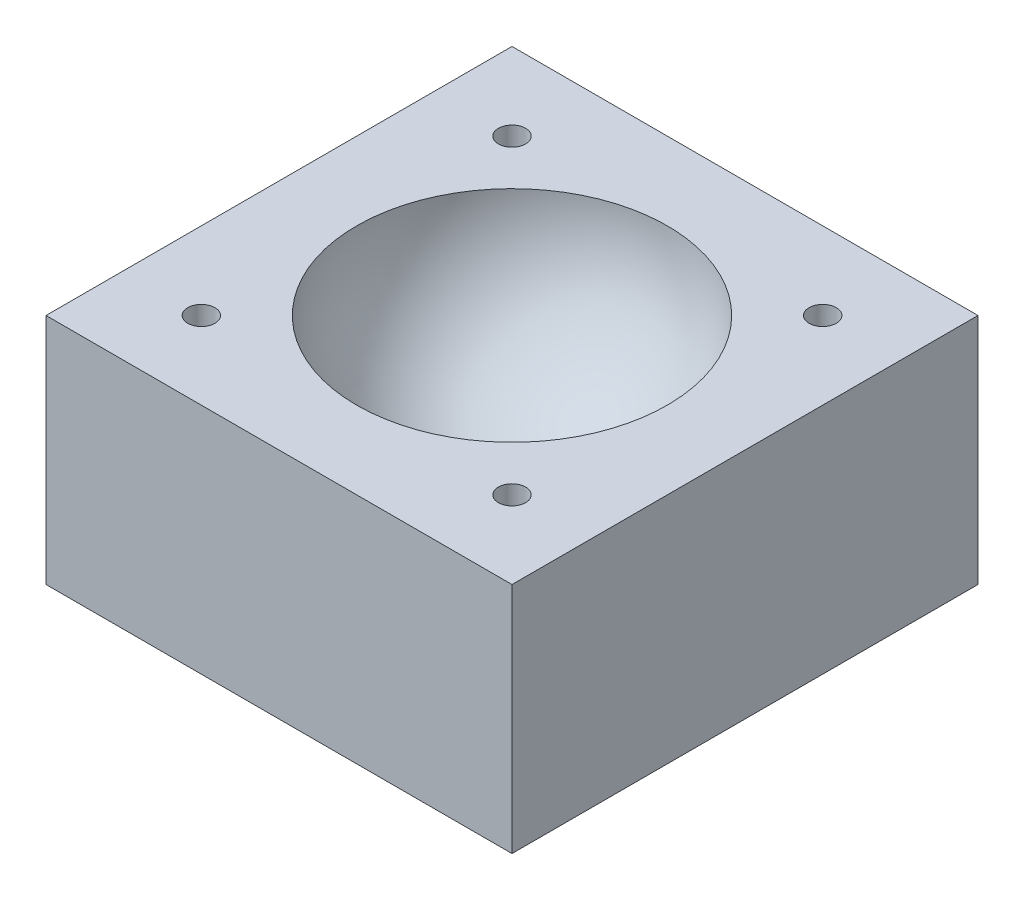
ISO-10303-21;
HEADER;
FILE_DESCRIPTION(('STEP AP214'),'2;1');
FILE_NAME('part.step','',(''),(''),'','','');
FILE_SCHEMA(('AUTOMOTIVE_DESIGN { 1 0 10303 214 1 1 1 1 }'));
ENDSEC;
DATA;
#1=APPLICATION_CONTEXT('core data for automotive mechanical design processes');
#2=APPLICATION_PROTOCOL_DEFINITION('international standard','automotive_design',2000,#1);
#3=PRODUCT_CONTEXT('',#1,'mechanical');
#4=PRODUCT('Part','Part','',(#3));
#5=PRODUCT_RELATED_PRODUCT_CATEGORY('part','',(#4));
#6=PRODUCT_DEFINITION_FORMATION('','',#4);
#7=PRODUCT_DEFINITION_CONTEXT('part definition',#1,'design');
#8=PRODUCT_DEFINITION('design','',#6,#7);
#9=PRODUCT_DEFINITION_SHAPE('','',#8);
#10=(LENGTH_UNIT() NAMED_UNIT(*) SI_UNIT(.MILLI.,.METRE.));
#11=(NAMED_UNIT(*) PLANE_ANGLE_UNIT() SI_UNIT($,.RADIAN.));
#12=(NAMED_UNIT(*) SI_UNIT($,.STERADIAN.) SOLID_ANGLE_UNIT());
#13=UNCERTAINTY_MEASURE_WITH_UNIT(LENGTH_MEASURE(1.E-05),#10,'distance_accuracy_value','');
#14=(GEOMETRIC_REPRESENTATION_CONTEXT(3) GLOBAL_UNCERTAINTY_ASSIGNED_CONTEXT((#13)) GLOBAL_UNIT_ASSIGNED_CONTEXT((#10,
#11,#12)) REPRESENTATION_CONTEXT('',''));
#15=CARTESIAN_POINT('',(0.,0.,0.));
#16=DIRECTION('',(0.,0.,1.));
#17=DIRECTION('',(1.,0.,0.));
#18=AXIS2_PLACEMENT_3D('',#15,#16,#17);
#19=CARTESIAN_POINT('',(30.,30.,-30.));
#20=DIRECTION('',(-1.,0.,0.));
#21=DIRECTION('',(0.,0.,1.));
#22=AXIS2_PLACEMENT_3D('',#19,#20,#21);
#23=PLANE('',#22);
#24=DIRECTION('',(0.,0.,-1.));
#25=VECTOR('',#24,1.);
#26=CARTESIAN_POINT('',(30.,0.,-30.));
#27=LINE('',#26,#25);
#28=CARTESIAN_POINT('',(30.,0.,30.));
#29=VERTEX_POINT('',#28);
#30=CARTESIAN_POINT('',(30.,0.,-30.));
#31=VERTEX_POINT('',#30);
#32=EDGE_CURVE('E107',#29,#31,#27,.T.);
#33=ORIENTED_EDGE('',*,*,#32,.T.);
#34=DIRECTION('',(0.,-1.,0.));
#35=VECTOR('',#34,1.);
#36=CARTESIAN_POINT('',(30.,30.,-30.));
#37=LINE('',#36,#35);
#38=CARTESIAN_POINT('',(30.,30.,-30.));
#39=VERTEX_POINT('',#38);
#40=EDGE_CURVE('E11',#39,#31,#37,.T.);
#41=ORIENTED_EDGE('',*,*,#40,.F.);
#42=DIRECTION('',(0.,0.,-1.));
#43=VECTOR('',#42,1.);
#44=CARTESIAN_POINT('',(30.,30.,-30.));
#45=LINE('',#44,#43);
#46=CARTESIAN_POINT('',(30.,30.,30.));
#47=VERTEX_POINT('',#46);
#48=EDGE_CURVE('E91',#47,#39,#45,.T.);
#49=ORIENTED_EDGE('',*,*,#48,.F.);
#50=DIRECTION('',(0.,-1.,0.));
#51=VECTOR('',#50,1.);
#52=CARTESIAN_POINT('',(30.,30.,30.));
#53=LINE('',#52,#51);
#54=EDGE_CURVE('E103',#47,#29,#53,.T.);
#55=ORIENTED_EDGE('',*,*,#54,.T.);
#56=EDGE_LOOP('',(#33,#41,#49,#55));
#57=FACE_BOUND('',#56,.T.);
#58=ADVANCED_FACE('F39',(#57),#23,.F.);
#59=CARTESIAN_POINT('',(-30.,30.,-30.));
#60=DIRECTION('',(0.,0.,1.));
#61=DIRECTION('',(1.,0.,0.));
#62=AXIS2_PLACEMENT_3D('',#59,#60,#61);
#63=PLANE('',#62);
#64=DIRECTION('',(-1.,0.,0.));
#65=VECTOR('',#64,1.);
#66=CARTESIAN_POINT('',(-30.,0.,-30.));
#67=LINE('',#66,#65);
#68=CARTESIAN_POINT('',(-30.,0.,-30.));
#69=VERTEX_POINT('',#68);
#70=EDGE_CURVE('E96',#31,#69,#67,.T.);
#71=ORIENTED_EDGE('',*,*,#70,.T.);
#72=DIRECTION('',(0.,-1.,0.));
#73=VECTOR('',#72,1.);
#74=CARTESIAN_POINT('',(-30.,30.,-30.));
#75=LINE('',#74,#73);
#76=CARTESIAN_POINT('',(-30.,30.,-30.));
#77=VERTEX_POINT('',#76);
#78=EDGE_CURVE('E48',#77,#69,#75,.T.);
#79=ORIENTED_EDGE('',*,*,#78,.F.);
#80=DIRECTION('',(-1.,0.,0.));
#81=VECTOR('',#80,1.);
#82=CARTESIAN_POINT('',(-30.,30.,-30.));
#83=LINE('',#82,#81);
#84=EDGE_CURVE('E86',#39,#77,#83,.T.);
#85=ORIENTED_EDGE('',*,*,#84,.F.);
#86=ORIENTED_EDGE('',*,*,#40,.T.);
#87=EDGE_LOOP('',(#71,#79,#85,#86));
#88=FACE_BOUND('',#87,.T.);
#89=ADVANCED_FACE('F95',(#88),#63,.F.);
#90=CARTESIAN_POINT('',(-30.,30.,-30.));
#91=DIRECTION('',(1.,0.,0.));
#92=DIRECTION('',(0.,0.,-1.));
#93=AXIS2_PLACEMENT_3D('',#90,#91,#92);
#94=PLANE('',#93);
#95=DIRECTION('',(0.,0.,1.));
#96=VECTOR('',#95,1.);
#97=CARTESIAN_POINT('',(-30.,0.,-30.));
#98=LINE('',#97,#96);
#99=CARTESIAN_POINT('',(-30.,0.,30.));
#100=VERTEX_POINT('',#99);
#101=EDGE_CURVE('E73',#69,#100,#98,.T.);
#102=ORIENTED_EDGE('',*,*,#101,.T.);
#103=DIRECTION('',(0.,-1.,0.));
#104=VECTOR('',#103,1.);
#105=CARTESIAN_POINT('',(-30.,30.,30.));
#106=LINE('',#105,#104);
#107=CARTESIAN_POINT('',(-30.,30.,30.));
#108=VERTEX_POINT('',#107);
#109=EDGE_CURVE('E98',#108,#100,#106,.T.);
#110=ORIENTED_EDGE('',*,*,#109,.F.);
#111=DIRECTION('',(0.,0.,1.));
#112=VECTOR('',#111,1.);
#113=CARTESIAN_POINT('',(-30.,30.,-30.));
#114=LINE('',#113,#112);
#115=EDGE_CURVE('E89',#77,#108,#114,.T.);
#116=ORIENTED_EDGE('',*,*,#115,.F.);
#117=ORIENTED_EDGE('',*,*,#78,.T.);
#118=EDGE_LOOP('',(#102,#110,#116,#117));
#119=FACE_BOUND('',#118,.T.);
#120=ADVANCED_FACE('F99',(#119),#94,.F.);
#121=CARTESIAN_POINT('',(-30.,30.,30.));
#122=DIRECTION('',(0.,0.,-1.));
#123=DIRECTION('',(-1.,0.,0.));
#124=AXIS2_PLACEMENT_3D('',#121,#122,#123);
#125=PLANE('',#124);
#126=DIRECTION('',(1.,0.,0.));
#127=VECTOR('',#126,1.);
#128=CARTESIAN_POINT('',(-30.,0.,30.));
#129=LINE('',#128,#127);
#130=EDGE_CURVE('E79',#100,#29,#129,.T.);
#131=ORIENTED_EDGE('',*,*,#130,.T.);
#132=ORIENTED_EDGE('',*,*,#54,.F.);
#133=DIRECTION('',(1.,0.,0.));
#134=VECTOR('',#133,1.);
#135=CARTESIAN_POINT('',(-30.,30.,30.));
#136=LINE('',#135,#134);
#137=EDGE_CURVE('E56',#108,#47,#136,.T.);
#138=ORIENTED_EDGE('',*,*,#137,.F.);
#139=ORIENTED_EDGE('',*,*,#109,.T.);
#140=EDGE_LOOP('',(#131,#132,#138,#139));
#141=FACE_BOUND('',#140,.T.);
#142=ADVANCED_FACE('F121',(#141),#125,.F.);
#143=CARTESIAN_POINT('',(0.,30.,0.));
#144=DIRECTION('',(0.,1.,0.));
#145=DIRECTION('',(0.,0.,1.));
#146=AXIS2_PLACEMENT_3D('',#143,#144,#145);
#147=PLANE('',#146);
#148=CARTESIAN_POINT('',(-20.,30.,20.));
#149=DIRECTION('',(0.,1.,0.));
#150=DIRECTION('',(0.,0.,1.));
#151=AXIS2_PLACEMENT_3D('',#148,#149,#150);
#152=CIRCLE('',#151,1.75);
#153=CARTESIAN_POINT('',(-20.,30.,21.75));
#154=VERTEX_POINT('',#153);
#155=EDGE_CURVE('E149',#154,#154,#152,.T.);
#156=ORIENTED_EDGE('',*,*,#155,.F.);
#157=EDGE_LOOP('',(#156));
#158=FACE_BOUND('',#157,.T.);
#159=CARTESIAN_POINT('',(20.,30.,-20.));
#160=DIRECTION('',(0.,1.,0.));
#161=DIRECTION('',(0.,0.,1.));
#162=AXIS2_PLACEMENT_3D('',#159,#160,#161);
#163=CIRCLE('',#162,1.75);
#164=CARTESIAN_POINT('',(20.,30.,-18.25));
#165=VERTEX_POINT('',#164);
#166=EDGE_CURVE('E140',#165,#165,#163,.T.);
#167=ORIENTED_EDGE('',*,*,#166,.F.);
#168=EDGE_LOOP('',(#167));
#169=FACE_BOUND('',#168,.T.);
#170=CARTESIAN_POINT('',(20.,30.,20.));
#171=DIRECTION('',(0.,1.,0.));
#172=DIRECTION('',(0.,0.,1.));
#173=AXIS2_PLACEMENT_3D('',#170,#171,#172);
#174=CIRCLE('',#173,1.75);
#175=CARTESIAN_POINT('',(20.,30.,21.75));
#176=VERTEX_POINT('',#175);
#177=EDGE_CURVE('E156',#176,#176,#174,.T.);
#178=ORIENTED_EDGE('',*,*,#177,.F.);
#179=EDGE_LOOP('',(#178));
#180=FACE_BOUND('',#179,.T.);
#181=CARTESIAN_POINT('',(-20.,30.,-20.));
#182=DIRECTION('',(0.,1.,0.));
#183=DIRECTION('',(0.,0.,1.));
#184=AXIS2_PLACEMENT_3D('',#181,#182,#183);
#185=CIRCLE('',#184,1.75);
#186=CARTESIAN_POINT('',(-20.,30.,-18.25));
#187=VERTEX_POINT('',#186);
#188=EDGE_CURVE('E132',#187,#187,#185,.T.);
#189=ORIENTED_EDGE('',*,*,#188,.F.);
#190=EDGE_LOOP('',(#189));
#191=FACE_BOUND('',#190,.T.);
#192=CARTESIAN_POINT('',(0.,30.,0.));
#193=DIRECTION('',(0.,-1.,0.));
#194=DIRECTION('',(0.,0.,1.));
#195=AXIS2_PLACEMENT_3D('',#192,#193,#194);
#196=CIRCLE('',#195,20.);
#197=CARTESIAN_POINT('',(0.,30.,20.));
#198=VERTEX_POINT('',#197);
#199=EDGE_CURVE('E111',#198,#198,#196,.T.);
#200=ORIENTED_EDGE('',*,*,#199,.T.);
#201=EDGE_LOOP('',(#200));
#202=FACE_BOUND('',#201,.T.);
#203=ORIENTED_EDGE('',*,*,#48,.T.);
#204=ORIENTED_EDGE('',*,*,#84,.T.);
#205=ORIENTED_EDGE('',*,*,#115,.T.);
#206=ORIENTED_EDGE('',*,*,#137,.T.);
#207=EDGE_LOOP('',(#203,#204,#205,#206));
#208=FACE_BOUND('',#207,.T.);
#209=ADVANCED_FACE('F87',(#158,#169,#180,#191,#202,#208),#147,.T.);
#210=CARTESIAN_POINT('',(0.,0.,0.));
#211=DIRECTION('',(0.,1.,0.));
#212=DIRECTION('',(0.,0.,1.));
#213=AXIS2_PLACEMENT_3D('',#210,#211,#212);
#214=PLANE('',#213);
#215=CARTESIAN_POINT('',(-20.,0.,20.));
#216=DIRECTION('',(0.,1.,0.));
#217=DIRECTION('',(0.,0.,1.));
#218=AXIS2_PLACEMENT_3D('',#215,#216,#217);
#219=CIRCLE('',#218,1.75);
#220=CARTESIAN_POINT('',(-20.,0.,21.75));
#221=VERTEX_POINT('',#220);
#222=EDGE_CURVE('E136',#221,#221,#219,.T.);
#223=ORIENTED_EDGE('',*,*,#222,.T.);
#224=EDGE_LOOP('',(#223));
#225=FACE_BOUND('',#224,.T.);
#226=CARTESIAN_POINT('',(20.,0.,-20.));
#227=DIRECTION('',(0.,1.,0.));
#228=DIRECTION('',(0.,0.,1.));
#229=AXIS2_PLACEMENT_3D('',#226,#227,#228);
#230=CIRCLE('',#229,1.75);
#231=CARTESIAN_POINT('',(20.,0.,-18.25));
#232=VERTEX_POINT('',#231);
#233=EDGE_CURVE('E144',#232,#232,#230,.T.);
#234=ORIENTED_EDGE('',*,*,#233,.T.);
#235=EDGE_LOOP('',(#234));
#236=FACE_BOUND('',#235,.T.);
#237=CARTESIAN_POINT('',(20.,0.,20.));
#238=DIRECTION('',(0.,1.,0.));
#239=DIRECTION('',(0.,0.,1.));
#240=AXIS2_PLACEMENT_3D('',#237,#238,#239);
#241=CIRCLE('',#240,1.75);
#242=CARTESIAN_POINT('',(20.,0.,21.75));
#243=VERTEX_POINT('',#242);
#244=EDGE_CURVE('E145',#243,#243,#241,.T.);
#245=ORIENTED_EDGE('',*,*,#244,.T.);
#246=EDGE_LOOP('',(#245));
#247=FACE_BOUND('',#246,.T.);
#248=CARTESIAN_POINT('',(-20.,0.,-20.));
#249=DIRECTION('',(0.,1.,0.));
#250=DIRECTION('',(0.,0.,1.));
#251=AXIS2_PLACEMENT_3D('',#248,#249,#250);
#252=CIRCLE('',#251,1.75);
#253=CARTESIAN_POINT('',(-20.,0.,-18.25));
#254=VERTEX_POINT('',#253);
#255=EDGE_CURVE('E131',#254,#254,#252,.T.);
#256=ORIENTED_EDGE('',*,*,#255,.T.);
#257=EDGE_LOOP('',(#256));
#258=FACE_BOUND('',#257,.T.);
#259=ORIENTED_EDGE('',*,*,#32,.F.);
#260=ORIENTED_EDGE('',*,*,#130,.F.);
#261=ORIENTED_EDGE('',*,*,#101,.F.);
#262=ORIENTED_EDGE('',*,*,#70,.F.);
#263=EDGE_LOOP('',(#259,#260,#261,#262));
#264=FACE_BOUND('',#263,.T.);
#265=ADVANCED_FACE('F124',(#225,#236,#247,#258,#264),#214,.F.);
#266=CARTESIAN_POINT('',(0.,30.,0.));
#267=DIRECTION('',(0.,0.,1.));
#268=DIRECTION('',(1.,0.,0.));
#269=AXIS2_PLACEMENT_3D('',#266,#267,#268);
#270=SPHERICAL_SURFACE('',#269,20.);
#271=CARTESIAN_POINT('',(0.,30.,0.));
#272=DIRECTION('',(0.,-1.,0.));
#273=DIRECTION('',(0.,0.,1.));
#274=AXIS2_PLACEMENT_3D('',#271,#272,#273);
#275=SPHERICAL_SURFACE('',#274,20.);
#276=ORIENTED_EDGE('',*,*,#199,.F.);
#277=EDGE_LOOP('',(#276));
#278=FACE_BOUND('',#277,.T.);
#279=ADVANCED_FACE('F182',(#278),#275,.F.);
#280=CARTESIAN_POINT('',(-20.,0.,-20.));
#281=DIRECTION('',(0.,1.,0.));
#282=DIRECTION('',(0.,0.,1.));
#283=AXIS2_PLACEMENT_3D('',#280,#281,#282);
#284=CYLINDRICAL_SURFACE('',#283,1.75);
#285=ORIENTED_EDGE('',*,*,#255,.F.);
#286=EDGE_LOOP('',(#285));
#287=FACE_BOUND('',#286,.T.);
#288=ORIENTED_EDGE('',*,*,#188,.T.);
#289=EDGE_LOOP('',(#288));
#290=FACE_BOUND('',#289,.T.);
#291=ADVANCED_FACE('F170',(#287,#290),#284,.F.);
#292=CARTESIAN_POINT('',(20.,0.,20.));
#293=DIRECTION('',(0.,1.,0.));
#294=DIRECTION('',(0.,0.,1.));
#295=AXIS2_PLACEMENT_3D('',#292,#293,#294);
#296=CYLINDRICAL_SURFACE('',#295,1.75);
#297=ORIENTED_EDGE('',*,*,#244,.F.);
#298=EDGE_LOOP('',(#297));
#299=FACE_BOUND('',#298,.T.);
#300=ORIENTED_EDGE('',*,*,#177,.T.);
#301=EDGE_LOOP('',(#300));
#302=FACE_BOUND('',#301,.T.);
#303=ADVANCED_FACE('F166',(#299,#302),#296,.F.);
#304=CARTESIAN_POINT('',(20.,0.,-20.));
#305=DIRECTION('',(0.,1.,0.));
#306=DIRECTION('',(0.,0.,1.));
#307=AXIS2_PLACEMENT_3D('',#304,#305,#306);
#308=CYLINDRICAL_SURFACE('',#307,1.75);
#309=ORIENTED_EDGE('',*,*,#233,.F.);
#310=EDGE_LOOP('',(#309));
#311=FACE_BOUND('',#310,.T.);
#312=ORIENTED_EDGE('',*,*,#166,.T.);
#313=EDGE_LOOP('',(#312));
#314=FACE_BOUND('',#313,.T.);
#315=ADVANCED_FACE('F169',(#311,#314),#308,.F.);
#316=CARTESIAN_POINT('',(-20.,0.,20.));
#317=DIRECTION('',(0.,1.,0.));
#318=DIRECTION('',(0.,0.,1.));
#319=AXIS2_PLACEMENT_3D('',#316,#317,#318);
#320=CYLINDRICAL_SURFACE('',#319,1.75);
#321=ORIENTED_EDGE('',*,*,#222,.F.);
#322=EDGE_LOOP('',(#321));
#323=FACE_BOUND('',#322,.T.);
#324=ORIENTED_EDGE('',*,*,#155,.T.);
#325=EDGE_LOOP('',(#324));
#326=FACE_BOUND('',#325,.T.);
#327=ADVANCED_FACE('F237',(#323,#326),#320,.F.);
#328=CLOSED_SHELL('',(#58,#89,#120,#142,#209,#265,#279,#291,#303,#315,#327));
#329=MANIFOLD_SOLID_BREP('B2',#328);
#330=ADVANCED_BREP_SHAPE_REPRESENTATION('',(#18,#329),#14);
#331=SHAPE_DEFINITION_REPRESENTATION(#9,#330);
ENDSEC;
END-ISO-10303-21;
